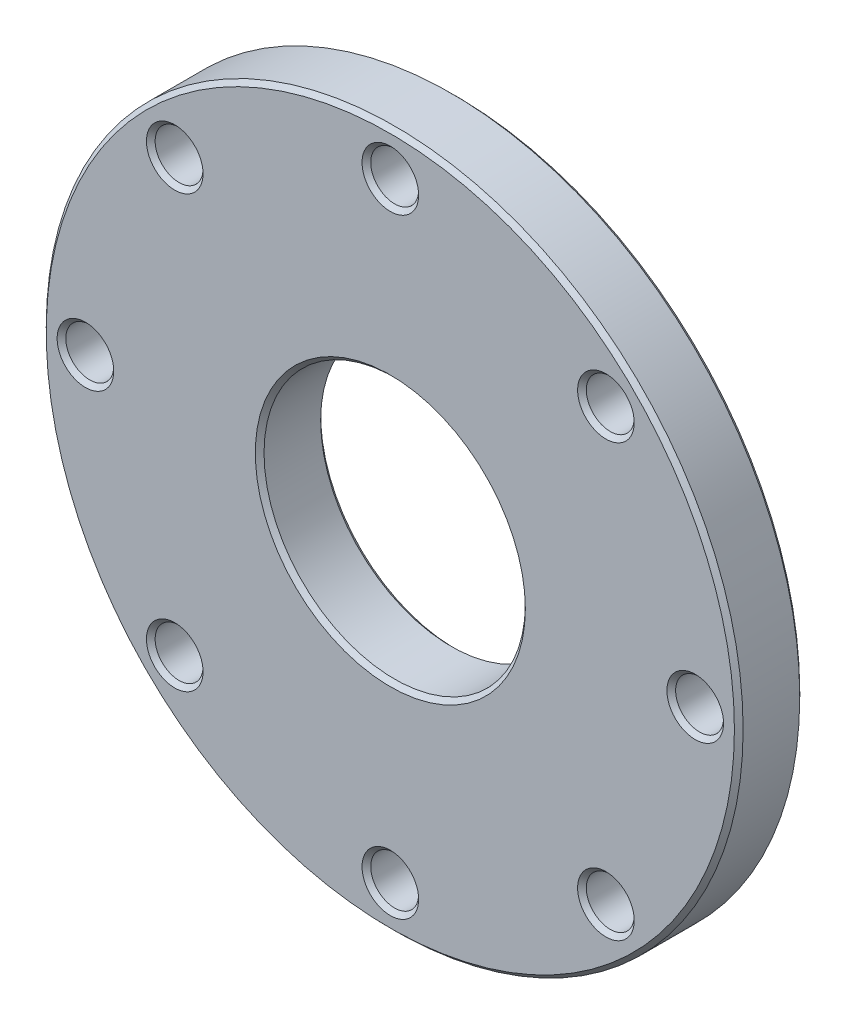
ISO-10303-21;
HEADER;
FILE_DESCRIPTION(('STEP AP214'),'2;1');
FILE_NAME('part.step','',(''),(''),'','','');
FILE_SCHEMA(('AUTOMOTIVE_DESIGN { 1 0 10303 214 1 1 1 1 }'));
ENDSEC;
DATA;
#1=APPLICATION_CONTEXT('core data for automotive mechanical design processes');
#2=APPLICATION_PROTOCOL_DEFINITION('international standard','automotive_design',2000,#1);
#3=PRODUCT_CONTEXT('',#1,'mechanical');
#4=PRODUCT('Part','Part','',(#3));
#5=PRODUCT_RELATED_PRODUCT_CATEGORY('part','',(#4));
#6=PRODUCT_DEFINITION_FORMATION('','',#4);
#7=PRODUCT_DEFINITION_CONTEXT('part definition',#1,'design');
#8=PRODUCT_DEFINITION('design','',#6,#7);
#9=PRODUCT_DEFINITION_SHAPE('','',#8);
#10=(LENGTH_UNIT() NAMED_UNIT(*) SI_UNIT(.MILLI.,.METRE.));
#11=(NAMED_UNIT(*) PLANE_ANGLE_UNIT() SI_UNIT($,.RADIAN.));
#12=(NAMED_UNIT(*) SI_UNIT($,.STERADIAN.) SOLID_ANGLE_UNIT());
#13=UNCERTAINTY_MEASURE_WITH_UNIT(LENGTH_MEASURE(1.E-05),#10,'distance_accuracy_value','');
#14=(GEOMETRIC_REPRESENTATION_CONTEXT(3) GLOBAL_UNCERTAINTY_ASSIGNED_CONTEXT((#13)) GLOBAL_UNIT_ASSIGNED_CONTEXT((#10,
#11,#12)) REPRESENTATION_CONTEXT('',''));
#15=CARTESIAN_POINT('',(0.,0.,0.));
#16=DIRECTION('',(0.,0.,1.));
#17=DIRECTION('',(1.,0.,0.));
#18=AXIS2_PLACEMENT_3D('',#15,#16,#17);
#19=CARTESIAN_POINT('',(-49.49747468305,49.497474683058,0.));
#20=DIRECTION('',(0.,0.,-1.));
#21=DIRECTION('',(1.,0.,0.));
#22=AXIS2_PLACEMENT_3D('',#19,#20,#21);
#23=CYLINDRICAL_SURFACE('',#22,5.5);
#24=CARTESIAN_POINT('',(-49.49747468305,49.497474683058,1.));
#25=DIRECTION('',(0.,0.,1.));
#26=DIRECTION('',(1.,0.,0.));
#27=AXIS2_PLACEMENT_3D('',#24,#25,#26);
#28=CIRCLE('',#27,5.5);
#29=CARTESIAN_POINT('',(-43.99747468305,49.497474683058,1.));
#30=VERTEX_POINT('',#29);
#31=EDGE_CURVE('E393',#30,#30,#28,.T.);
#32=ORIENTED_EDGE('',*,*,#31,.F.);
#33=DIRECTION('',(0.,0.,1.));
#34=VECTOR('',#33,1.);
#35=CARTESIAN_POINT('',(-43.99747468305,49.497474683058,0.));
#36=LINE('',#35,#34);
#37=CARTESIAN_POINT('',(-43.99747468305,49.497474683058,14.));
#38=VERTEX_POINT('',#37);
#39=EDGE_CURVE('E10',#30,#38,#36,.T.);
#40=ORIENTED_EDGE('',*,*,#39,.T.);
#41=CARTESIAN_POINT('',(-49.49747468305,49.497474683058,14.));
#42=DIRECTION('',(0.,0.,-1.));
#43=DIRECTION('',(1.,0.,0.));
#44=AXIS2_PLACEMENT_3D('',#41,#42,#43);
#45=CIRCLE('',#44,5.5);
#46=EDGE_CURVE('E431',#38,#38,#45,.T.);
#47=ORIENTED_EDGE('',*,*,#46,.F.);
#48=ORIENTED_EDGE('',*,*,#39,.F.);
#49=EDGE_LOOP('',(#32,#40,#47,#48));
#50=FACE_BOUND('',#49,.T.);
#51=ADVANCED_FACE('F16',(#50),#23,.F.);
#52=CARTESIAN_POINT('',(0.,70.,0.));
#53=DIRECTION('',(0.,0.,-1.));
#54=DIRECTION('',(1.,0.,0.));
#55=AXIS2_PLACEMENT_3D('',#52,#53,#54);
#56=CYLINDRICAL_SURFACE('',#55,5.5);
#57=CARTESIAN_POINT('',(0.,70.,1.));
#58=DIRECTION('',(0.,0.,1.));
#59=DIRECTION('',(1.,0.,0.));
#60=AXIS2_PLACEMENT_3D('',#57,#58,#59);
#61=CIRCLE('',#60,5.5);
#62=CARTESIAN_POINT('',(5.5,70.,1.));
#63=VERTEX_POINT('',#62);
#64=EDGE_CURVE('E241',#63,#63,#61,.T.);
#65=ORIENTED_EDGE('',*,*,#64,.F.);
#66=DIRECTION('',(0.,0.,1.));
#67=VECTOR('',#66,1.);
#68=CARTESIAN_POINT('',(5.5,70.,0.));
#69=LINE('',#68,#67);
#70=CARTESIAN_POINT('',(5.5,70.,14.));
#71=VERTEX_POINT('',#70);
#72=EDGE_CURVE('E25',#63,#71,#69,.T.);
#73=ORIENTED_EDGE('',*,*,#72,.T.);
#74=CARTESIAN_POINT('',(0.,70.,14.));
#75=DIRECTION('',(0.,0.,-1.));
#76=DIRECTION('',(1.,0.,0.));
#77=AXIS2_PLACEMENT_3D('',#74,#75,#76);
#78=CIRCLE('',#77,5.5);
#79=EDGE_CURVE('E411',#71,#71,#78,.T.);
#80=ORIENTED_EDGE('',*,*,#79,.F.);
#81=ORIENTED_EDGE('',*,*,#72,.F.);
#82=EDGE_LOOP('',(#65,#73,#80,#81));
#83=FACE_BOUND('',#82,.T.);
#84=ADVANCED_FACE('F18',(#83),#56,.F.);
#85=CARTESIAN_POINT('',(-70.,0.,0.));
#86=DIRECTION('',(0.,0.,-1.));
#87=DIRECTION('',(1.,0.,0.));
#88=AXIS2_PLACEMENT_3D('',#85,#86,#87);
#89=CYLINDRICAL_SURFACE('',#88,5.5);
#90=CARTESIAN_POINT('',(-70.,0.,1.));
#91=DIRECTION('',(0.,0.,1.));
#92=DIRECTION('',(1.,0.,0.));
#93=AXIS2_PLACEMENT_3D('',#90,#91,#92);
#94=CIRCLE('',#93,5.5);
#95=CARTESIAN_POINT('',(-64.5,0.,1.));
#96=VERTEX_POINT('',#95);
#97=EDGE_CURVE('E242',#96,#96,#94,.T.);
#98=ORIENTED_EDGE('',*,*,#97,.F.);
#99=DIRECTION('',(0.,0.,1.));
#100=VECTOR('',#99,1.);
#101=CARTESIAN_POINT('',(-64.5,0.,0.));
#102=LINE('',#101,#100);
#103=CARTESIAN_POINT('',(-64.5,0.,14.));
#104=VERTEX_POINT('',#103);
#105=EDGE_CURVE('E321',#96,#104,#102,.T.);
#106=ORIENTED_EDGE('',*,*,#105,.T.);
#107=CARTESIAN_POINT('',(-70.,0.,14.));
#108=DIRECTION('',(0.,0.,-1.));
#109=DIRECTION('',(1.,0.,0.));
#110=AXIS2_PLACEMENT_3D('',#107,#108,#109);
#111=CIRCLE('',#110,5.5);
#112=EDGE_CURVE('E423',#104,#104,#111,.T.);
#113=ORIENTED_EDGE('',*,*,#112,.F.);
#114=ORIENTED_EDGE('',*,*,#105,.F.);
#115=EDGE_LOOP('',(#98,#106,#113,#114));
#116=FACE_BOUND('',#115,.T.);
#117=ADVANCED_FACE('F508',(#116),#89,.F.);
#118=CARTESIAN_POINT('',(0.,0.,0.));
#119=DIRECTION('',(0.,0.,-1.));
#120=DIRECTION('',(1.,0.,0.));
#121=AXIS2_PLACEMENT_3D('',#118,#119,#120);
#122=CYLINDRICAL_SURFACE('',#121,30.);
#123=CARTESIAN_POINT('',(0.,0.,1.));
#124=DIRECTION('',(0.,0.,1.));
#125=DIRECTION('',(1.,0.,0.));
#126=AXIS2_PLACEMENT_3D('',#123,#124,#125);
#127=CIRCLE('',#126,30.);
#128=CARTESIAN_POINT('',(30.,0.,1.));
#129=VERTEX_POINT('',#128);
#130=EDGE_CURVE('E377',#129,#129,#127,.T.);
#131=ORIENTED_EDGE('',*,*,#130,.F.);
#132=DIRECTION('',(0.,0.,1.));
#133=VECTOR('',#132,1.);
#134=CARTESIAN_POINT('',(30.,0.,0.));
#135=LINE('',#134,#133);
#136=CARTESIAN_POINT('',(30.,0.,14.));
#137=VERTEX_POINT('',#136);
#138=EDGE_CURVE('E324',#129,#137,#135,.T.);
#139=ORIENTED_EDGE('',*,*,#138,.T.);
#140=CARTESIAN_POINT('',(0.,0.,14.));
#141=DIRECTION('',(0.,0.,-1.));
#142=DIRECTION('',(1.,0.,0.));
#143=AXIS2_PLACEMENT_3D('',#140,#141,#142);
#144=CIRCLE('',#143,30.);
#145=EDGE_CURVE('E439',#137,#137,#144,.T.);
#146=ORIENTED_EDGE('',*,*,#145,.F.);
#147=ORIENTED_EDGE('',*,*,#138,.F.);
#148=EDGE_LOOP('',(#131,#139,#146,#147));
#149=FACE_BOUND('',#148,.T.);
#150=ADVANCED_FACE('F513',(#149),#122,.F.);
#151=CARTESIAN_POINT('',(49.497474683058,49.497474683058,0.));
#152=DIRECTION('',(0.,0.,-1.));
#153=DIRECTION('',(1.,0.,0.));
#154=AXIS2_PLACEMENT_3D('',#151,#152,#153);
#155=CYLINDRICAL_SURFACE('',#154,5.5);
#156=CARTESIAN_POINT('',(49.497474683058,49.497474683058,1.));
#157=DIRECTION('',(0.,0.,1.));
#158=DIRECTION('',(1.,0.,0.));
#159=AXIS2_PLACEMENT_3D('',#156,#157,#158);
#160=CIRCLE('',#159,5.5);
#161=CARTESIAN_POINT('',(54.997474683058,49.497474683058,1.));
#162=VERTEX_POINT('',#161);
#163=EDGE_CURVE('E369',#162,#162,#160,.T.);
#164=ORIENTED_EDGE('',*,*,#163,.F.);
#165=DIRECTION('',(0.,0.,1.));
#166=VECTOR('',#165,1.);
#167=CARTESIAN_POINT('',(54.997474683058,49.497474683058,0.));
#168=LINE('',#167,#166);
#169=CARTESIAN_POINT('',(54.997474683058,49.497474683058,14.));
#170=VERTEX_POINT('',#169);
#171=EDGE_CURVE('E37',#162,#170,#168,.T.);
#172=ORIENTED_EDGE('',*,*,#171,.T.);
#173=CARTESIAN_POINT('',(49.497474683058,49.497474683058,14.));
#174=DIRECTION('',(0.,0.,-1.));
#175=DIRECTION('',(1.,0.,0.));
#176=AXIS2_PLACEMENT_3D('',#173,#174,#175);
#177=CIRCLE('',#176,5.5);
#178=EDGE_CURVE('E378',#170,#170,#177,.T.);
#179=ORIENTED_EDGE('',*,*,#178,.F.);
#180=ORIENTED_EDGE('',*,*,#171,.F.);
#181=EDGE_LOOP('',(#164,#172,#179,#180));
#182=FACE_BOUND('',#181,.T.);
#183=ADVANCED_FACE('F721',(#182),#155,.F.);
#184=CARTESIAN_POINT('',(70.,0.,0.));
#185=DIRECTION('',(0.,0.,-1.));
#186=DIRECTION('',(1.,0.,0.));
#187=AXIS2_PLACEMENT_3D('',#184,#185,#186);
#188=CYLINDRICAL_SURFACE('',#187,5.5);
#189=CARTESIAN_POINT('',(70.,0.,1.));
#190=DIRECTION('',(0.,0.,1.));
#191=DIRECTION('',(1.,0.,0.));
#192=AXIS2_PLACEMENT_3D('',#189,#190,#191);
#193=CIRCLE('',#192,5.5);
#194=CARTESIAN_POINT('',(75.5,0.,1.));
#195=VERTEX_POINT('',#194);
#196=EDGE_CURVE('E300',#195,#195,#193,.T.);
#197=ORIENTED_EDGE('',*,*,#196,.F.);
#198=DIRECTION('',(0.,0.,1.));
#199=VECTOR('',#198,1.);
#200=CARTESIAN_POINT('',(75.5,0.,0.));
#201=LINE('',#200,#199);
#202=CARTESIAN_POINT('',(75.5,0.,14.));
#203=VERTEX_POINT('',#202);
#204=EDGE_CURVE('E325',#195,#203,#201,.T.);
#205=ORIENTED_EDGE('',*,*,#204,.T.);
#206=CARTESIAN_POINT('',(70.,0.,14.));
#207=DIRECTION('',(0.,0.,-1.));
#208=DIRECTION('',(1.,0.,0.));
#209=AXIS2_PLACEMENT_3D('',#206,#207,#208);
#210=CIRCLE('',#209,5.5);
#211=EDGE_CURVE('E255',#203,#203,#210,.T.);
#212=ORIENTED_EDGE('',*,*,#211,.F.);
#213=ORIENTED_EDGE('',*,*,#204,.F.);
#214=EDGE_LOOP('',(#197,#205,#212,#213));
#215=FACE_BOUND('',#214,.T.);
#216=ADVANCED_FACE('F712',(#215),#188,.F.);
#217=CARTESIAN_POINT('',(-49.49747468305,-49.49747468305,0.));
#218=DIRECTION('',(0.,0.,-1.));
#219=DIRECTION('',(1.,0.,0.));
#220=AXIS2_PLACEMENT_3D('',#217,#218,#219);
#221=CYLINDRICAL_SURFACE('',#220,5.5);
#222=CARTESIAN_POINT('',(-49.49747468305,-49.49747468305,1.));
#223=DIRECTION('',(0.,0.,1.));
#224=DIRECTION('',(1.,0.,0.));
#225=AXIS2_PLACEMENT_3D('',#222,#223,#224);
#226=CIRCLE('',#225,5.5);
#227=CARTESIAN_POINT('',(-43.99747468305,-49.49747468305,1.));
#228=VERTEX_POINT('',#227);
#229=EDGE_CURVE('E301',#228,#228,#226,.T.);
#230=ORIENTED_EDGE('',*,*,#229,.F.);
#231=DIRECTION('',(0.,0.,1.));
#232=VECTOR('',#231,1.);
#233=CARTESIAN_POINT('',(-43.99747468305,-49.49747468305,0.));
#234=LINE('',#233,#232);
#235=CARTESIAN_POINT('',(-43.99747468305,-49.49747468305,14.));
#236=VERTEX_POINT('',#235);
#237=EDGE_CURVE('E328',#228,#236,#234,.T.);
#238=ORIENTED_EDGE('',*,*,#237,.T.);
#239=CARTESIAN_POINT('',(-49.49747468305,-49.49747468305,14.));
#240=DIRECTION('',(0.,0.,-1.));
#241=DIRECTION('',(1.,0.,0.));
#242=AXIS2_PLACEMENT_3D('',#239,#240,#241);
#243=CIRCLE('',#242,5.5);
#244=EDGE_CURVE('E401',#236,#236,#243,.T.);
#245=ORIENTED_EDGE('',*,*,#244,.F.);
#246=ORIENTED_EDGE('',*,*,#237,.F.);
#247=EDGE_LOOP('',(#230,#238,#245,#246));
#248=FACE_BOUND('',#247,.T.);
#249=ADVANCED_FACE('F703',(#248),#221,.F.);
#250=CARTESIAN_POINT('',(0.,-70.,0.));
#251=DIRECTION('',(0.,0.,-1.));
#252=DIRECTION('',(1.,0.,0.));
#253=AXIS2_PLACEMENT_3D('',#250,#251,#252);
#254=CYLINDRICAL_SURFACE('',#253,5.5);
#255=CARTESIAN_POINT('',(0.,-70.,1.));
#256=DIRECTION('',(0.,0.,1.));
#257=DIRECTION('',(1.,0.,0.));
#258=AXIS2_PLACEMENT_3D('',#255,#256,#257);
#259=CIRCLE('',#258,5.5);
#260=CARTESIAN_POINT('',(5.5,-70.,1.));
#261=VERTEX_POINT('',#260);
#262=EDGE_CURVE('E344',#261,#261,#259,.T.);
#263=ORIENTED_EDGE('',*,*,#262,.F.);
#264=DIRECTION('',(0.,0.,1.));
#265=VECTOR('',#264,1.);
#266=CARTESIAN_POINT('',(5.5,-70.,0.));
#267=LINE('',#266,#265);
#268=CARTESIAN_POINT('',(5.5,-70.,14.));
#269=VERTEX_POINT('',#268);
#270=EDGE_CURVE('E354',#261,#269,#267,.T.);
#271=ORIENTED_EDGE('',*,*,#270,.T.);
#272=CARTESIAN_POINT('',(0.,-70.,14.));
#273=DIRECTION('',(0.,0.,-1.));
#274=DIRECTION('',(1.,0.,0.));
#275=AXIS2_PLACEMENT_3D('',#272,#273,#274);
#276=CIRCLE('',#275,5.5);
#277=EDGE_CURVE('E226',#269,#269,#276,.T.);
#278=ORIENTED_EDGE('',*,*,#277,.F.);
#279=ORIENTED_EDGE('',*,*,#270,.F.);
#280=EDGE_LOOP('',(#263,#271,#278,#279));
#281=FACE_BOUND('',#280,.T.);
#282=ADVANCED_FACE('F694',(#281),#254,.F.);
#283=CARTESIAN_POINT('',(49.497474683058,-49.49747468305,0.));
#284=DIRECTION('',(0.,0.,-1.));
#285=DIRECTION('',(1.,0.,0.));
#286=AXIS2_PLACEMENT_3D('',#283,#284,#285);
#287=CYLINDRICAL_SURFACE('',#286,5.5);
#288=CARTESIAN_POINT('',(49.497474683058,-49.49747468305,1.));
#289=DIRECTION('',(0.,0.,1.));
#290=DIRECTION('',(1.,0.,0.));
#291=AXIS2_PLACEMENT_3D('',#288,#289,#290);
#292=CIRCLE('',#291,5.5);
#293=CARTESIAN_POINT('',(54.997474683058,-49.49747468305,1.));
#294=VERTEX_POINT('',#293);
#295=EDGE_CURVE('E336',#294,#294,#292,.T.);
#296=ORIENTED_EDGE('',*,*,#295,.F.);
#297=DIRECTION('',(0.,0.,1.));
#298=VECTOR('',#297,1.);
#299=CARTESIAN_POINT('',(54.997474683058,-49.49747468305,0.));
#300=LINE('',#299,#298);
#301=CARTESIAN_POINT('',(54.997474683058,-49.49747468305,14.));
#302=VERTEX_POINT('',#301);
#303=EDGE_CURVE('E381',#294,#302,#300,.T.);
#304=ORIENTED_EDGE('',*,*,#303,.T.);
#305=CARTESIAN_POINT('',(49.497474683058,-49.49747468305,14.));
#306=DIRECTION('',(0.,0.,-1.));
#307=DIRECTION('',(1.,0.,0.));
#308=AXIS2_PLACEMENT_3D('',#305,#306,#307);
#309=CIRCLE('',#308,5.5);
#310=EDGE_CURVE('E415',#302,#302,#309,.T.);
#311=ORIENTED_EDGE('',*,*,#310,.F.);
#312=ORIENTED_EDGE('',*,*,#303,.F.);
#313=EDGE_LOOP('',(#296,#304,#311,#312));
#314=FACE_BOUND('',#313,.T.);
#315=ADVANCED_FACE('F685',(#314),#287,.F.);
#316=CARTESIAN_POINT('',(49.497474683058,49.497474683058,14.));
#317=DIRECTION('',(0.,0.,1.));
#318=DIRECTION('',(1.,0.,0.));
#319=AXIS2_PLACEMENT_3D('',#316,#317,#318);
#320=CONICAL_SURFACE('',#319,5.5,0.785398163397);
#321=DIRECTION('',(-0.707106781186548,0.,-0.707106781186548));
#322=VECTOR('',#321,1.);
#323=CARTESIAN_POINT('',(54.997474683058,49.497474683058,14.));
#324=LINE('',#323,#322);
#325=CARTESIAN_POINT('',(55.997474683058,49.497474683058,15.));
#326=VERTEX_POINT('',#325);
#327=EDGE_CURVE('E382',#326,#170,#324,.T.);
#328=ORIENTED_EDGE('',*,*,#327,.T.);
#329=ORIENTED_EDGE('',*,*,#178,.T.);
#330=ORIENTED_EDGE('',*,*,#327,.F.);
#331=CARTESIAN_POINT('',(49.497474683058,49.497474683058,15.));
#332=DIRECTION('',(0.,0.,-1.));
#333=DIRECTION('',(1.,0.,0.));
#334=AXIS2_PLACEMENT_3D('',#331,#332,#333);
#335=CIRCLE('',#334,6.5);
#336=EDGE_CURVE('E320',#326,#326,#335,.T.);
#337=ORIENTED_EDGE('',*,*,#336,.F.);
#338=EDGE_LOOP('',(#328,#329,#330,#337));
#339=FACE_BOUND('',#338,.T.);
#340=ADVANCED_FACE('F676',(#339),#320,.F.);
#341=CARTESIAN_POINT('',(0.,70.,14.));
#342=DIRECTION('',(0.,0.,1.));
#343=DIRECTION('',(1.,0.,0.));
#344=AXIS2_PLACEMENT_3D('',#341,#342,#343);
#345=CONICAL_SURFACE('',#344,5.5,0.785398163397);
#346=DIRECTION('',(-0.707106781186548,0.,-0.707106781186548));
#347=VECTOR('',#346,1.);
#348=CARTESIAN_POINT('',(5.5,70.,14.));
#349=LINE('',#348,#347);
#350=CARTESIAN_POINT('',(6.5,70.,15.));
#351=VERTEX_POINT('',#350);
#352=EDGE_CURVE('E259',#351,#71,#349,.T.);
#353=ORIENTED_EDGE('',*,*,#352,.T.);
#354=ORIENTED_EDGE('',*,*,#79,.T.);
#355=ORIENTED_EDGE('',*,*,#352,.F.);
#356=CARTESIAN_POINT('',(0.,70.,15.));
#357=DIRECTION('',(0.,0.,-1.));
#358=DIRECTION('',(1.,0.,0.));
#359=AXIS2_PLACEMENT_3D('',#356,#357,#358);
#360=CIRCLE('',#359,6.5);
#361=EDGE_CURVE('E316',#351,#351,#360,.T.);
#362=ORIENTED_EDGE('',*,*,#361,.F.);
#363=EDGE_LOOP('',(#353,#354,#355,#362));
#364=FACE_BOUND('',#363,.T.);
#365=ADVANCED_FACE('F598',(#364),#345,.F.);
#366=CARTESIAN_POINT('',(70.,0.,14.));
#367=DIRECTION('',(0.,0.,1.));
#368=DIRECTION('',(1.,0.,0.));
#369=AXIS2_PLACEMENT_3D('',#366,#367,#368);
#370=CONICAL_SURFACE('',#369,5.5,0.785398163397);
#371=DIRECTION('',(-0.707106781186548,0.,-0.707106781186548));
#372=VECTOR('',#371,1.);
#373=CARTESIAN_POINT('',(75.5,0.,14.));
#374=LINE('',#373,#372);
#375=CARTESIAN_POINT('',(76.5,0.,15.));
#376=VERTEX_POINT('',#375);
#377=EDGE_CURVE('E260',#376,#203,#374,.T.);
#378=ORIENTED_EDGE('',*,*,#377,.T.);
#379=ORIENTED_EDGE('',*,*,#211,.T.);
#380=ORIENTED_EDGE('',*,*,#377,.F.);
#381=CARTESIAN_POINT('',(70.,0.,15.));
#382=DIRECTION('',(0.,0.,-1.));
#383=DIRECTION('',(1.,0.,0.));
#384=AXIS2_PLACEMENT_3D('',#381,#382,#383);
#385=CIRCLE('',#384,6.5);
#386=EDGE_CURVE('E312',#376,#376,#385,.T.);
#387=ORIENTED_EDGE('',*,*,#386,.F.);
#388=EDGE_LOOP('',(#378,#379,#380,#387));
#389=FACE_BOUND('',#388,.T.);
#390=ADVANCED_FACE('F592',(#389),#370,.F.);
#391=CARTESIAN_POINT('',(0.,0.,14.));
#392=DIRECTION('',(0.,0.,1.));
#393=DIRECTION('',(1.,0.,0.));
#394=AXIS2_PLACEMENT_3D('',#391,#392,#393);
#395=CONICAL_SURFACE('',#394,30.,0.785398163397);
#396=DIRECTION('',(-0.707106781186548,0.,-0.707106781186548));
#397=VECTOR('',#396,1.);
#398=CARTESIAN_POINT('',(30.,0.,14.));
#399=LINE('',#398,#397);
#400=CARTESIAN_POINT('',(31.,0.,15.));
#401=VERTEX_POINT('',#400);
#402=EDGE_CURVE('E435',#401,#137,#399,.T.);
#403=ORIENTED_EDGE('',*,*,#402,.T.);
#404=ORIENTED_EDGE('',*,*,#145,.T.);
#405=ORIENTED_EDGE('',*,*,#402,.F.);
#406=CARTESIAN_POINT('',(0.,0.,15.));
#407=DIRECTION('',(0.,0.,-1.));
#408=DIRECTION('',(1.,0.,0.));
#409=AXIS2_PLACEMENT_3D('',#406,#407,#408);
#410=CIRCLE('',#409,31.);
#411=EDGE_CURVE('E285',#401,#401,#410,.T.);
#412=ORIENTED_EDGE('',*,*,#411,.F.);
#413=EDGE_LOOP('',(#403,#404,#405,#412));
#414=FACE_BOUND('',#413,.T.);
#415=ADVANCED_FACE('F597',(#414),#395,.F.);
#416=CARTESIAN_POINT('',(-49.49747468305,49.497474683058,14.));
#417=DIRECTION('',(0.,0.,1.));
#418=DIRECTION('',(1.,0.,0.));
#419=AXIS2_PLACEMENT_3D('',#416,#417,#418);
#420=CONICAL_SURFACE('',#419,5.5,0.785398163397);
#421=DIRECTION('',(-0.707106781186548,0.,-0.707106781186548));
#422=VECTOR('',#421,1.);
#423=CARTESIAN_POINT('',(-43.99747468305,49.497474683058,14.));
#424=LINE('',#423,#422);
#425=CARTESIAN_POINT('',(-42.99747468305,49.497474683058,15.));
#426=VERTEX_POINT('',#425);
#427=EDGE_CURVE('E427',#426,#38,#424,.T.);
#428=ORIENTED_EDGE('',*,*,#427,.T.);
#429=ORIENTED_EDGE('',*,*,#46,.T.);
#430=ORIENTED_EDGE('',*,*,#427,.F.);
#431=CARTESIAN_POINT('',(-49.49747468305,49.497474683058,15.));
#432=DIRECTION('',(0.,0.,-1.));
#433=DIRECTION('',(1.,0.,0.));
#434=AXIS2_PLACEMENT_3D('',#431,#432,#433);
#435=CIRCLE('',#434,6.5);
#436=EDGE_CURVE('E281',#426,#426,#435,.T.);
#437=ORIENTED_EDGE('',*,*,#436,.F.);
#438=EDGE_LOOP('',(#428,#429,#430,#437));
#439=FACE_BOUND('',#438,.T.);
#440=ADVANCED_FACE('F653',(#439),#420,.F.);
#441=CARTESIAN_POINT('',(-70.,0.,14.));
#442=DIRECTION('',(0.,0.,1.));
#443=DIRECTION('',(1.,0.,0.));
#444=AXIS2_PLACEMENT_3D('',#441,#442,#443);
#445=CONICAL_SURFACE('',#444,5.5,0.785398163397);
#446=DIRECTION('',(-0.707106781186548,0.,-0.707106781186548));
#447=VECTOR('',#446,1.);
#448=CARTESIAN_POINT('',(-64.5,0.,14.));
#449=LINE('',#448,#447);
#450=CARTESIAN_POINT('',(-63.5,0.,15.));
#451=VERTEX_POINT('',#450);
#452=EDGE_CURVE('E419',#451,#104,#449,.T.);
#453=ORIENTED_EDGE('',*,*,#452,.T.);
#454=ORIENTED_EDGE('',*,*,#112,.T.);
#455=ORIENTED_EDGE('',*,*,#452,.F.);
#456=CARTESIAN_POINT('',(-70.,0.,15.));
#457=DIRECTION('',(0.,0.,-1.));
#458=DIRECTION('',(1.,0.,0.));
#459=AXIS2_PLACEMENT_3D('',#456,#457,#458);
#460=CIRCLE('',#459,6.5);
#461=EDGE_CURVE('E286',#451,#451,#460,.T.);
#462=ORIENTED_EDGE('',*,*,#461,.F.);
#463=EDGE_LOOP('',(#453,#454,#455,#462));
#464=FACE_BOUND('',#463,.T.);
#465=ADVANCED_FACE('F636',(#464),#445,.F.);
#466=CARTESIAN_POINT('',(49.497474683058,-49.49747468305,14.));
#467=DIRECTION('',(0.,0.,1.));
#468=DIRECTION('',(1.,0.,0.));
#469=AXIS2_PLACEMENT_3D('',#466,#467,#468);
#470=CONICAL_SURFACE('',#469,5.5,0.785398163397);
#471=DIRECTION('',(-0.707106781186548,0.,-0.707106781186548));
#472=VECTOR('',#471,1.);
#473=CARTESIAN_POINT('',(54.997474683058,-49.49747468305,14.));
#474=LINE('',#473,#472);
#475=CARTESIAN_POINT('',(55.997474683058,-49.49747468305,15.));
#476=VERTEX_POINT('',#475);
#477=EDGE_CURVE('E228',#476,#302,#474,.T.);
#478=ORIENTED_EDGE('',*,*,#477,.T.);
#479=ORIENTED_EDGE('',*,*,#310,.T.);
#480=ORIENTED_EDGE('',*,*,#477,.F.);
#481=CARTESIAN_POINT('',(49.497474683058,-49.49747468305,15.));
#482=DIRECTION('',(0.,0.,-1.));
#483=DIRECTION('',(1.,0.,0.));
#484=AXIS2_PLACEMENT_3D('',#481,#482,#483);
#485=CIRCLE('',#484,6.5);
#486=EDGE_CURVE('E305',#476,#476,#485,.T.);
#487=ORIENTED_EDGE('',*,*,#486,.F.);
#488=EDGE_LOOP('',(#478,#479,#480,#487));
#489=FACE_BOUND('',#488,.T.);
#490=ADVANCED_FACE('F544',(#489),#470,.F.);
#491=CARTESIAN_POINT('',(0.,-70.,14.));
#492=DIRECTION('',(0.,0.,1.));
#493=DIRECTION('',(1.,0.,0.));
#494=AXIS2_PLACEMENT_3D('',#491,#492,#493);
#495=CONICAL_SURFACE('',#494,5.5,0.785398163397);
#496=DIRECTION('',(-0.707106781186548,0.,-0.707106781186548));
#497=VECTOR('',#496,1.);
#498=CARTESIAN_POINT('',(5.5,-70.,14.));
#499=LINE('',#498,#497);
#500=CARTESIAN_POINT('',(6.5,-70.,15.));
#501=VERTEX_POINT('',#500);
#502=EDGE_CURVE('E229',#501,#269,#499,.T.);
#503=ORIENTED_EDGE('',*,*,#502,.T.);
#504=ORIENTED_EDGE('',*,*,#277,.T.);
#505=ORIENTED_EDGE('',*,*,#502,.F.);
#506=CARTESIAN_POINT('',(0.,-70.,15.));
#507=DIRECTION('',(0.,0.,-1.));
#508=DIRECTION('',(1.,0.,0.));
#509=AXIS2_PLACEMENT_3D('',#506,#507,#508);
#510=CIRCLE('',#509,6.5);
#511=EDGE_CURVE('E295',#501,#501,#510,.T.);
#512=ORIENTED_EDGE('',*,*,#511,.F.);
#513=EDGE_LOOP('',(#503,#504,#505,#512));
#514=FACE_BOUND('',#513,.T.);
#515=ADVANCED_FACE('F538',(#514),#495,.F.);
#516=CARTESIAN_POINT('',(-49.49747468305,-49.49747468305,14.));
#517=DIRECTION('',(0.,0.,1.));
#518=DIRECTION('',(1.,0.,0.));
#519=AXIS2_PLACEMENT_3D('',#516,#517,#518);
#520=CONICAL_SURFACE('',#519,5.5,0.785398163397);
#521=DIRECTION('',(-0.707106781186548,0.,-0.707106781186548));
#522=VECTOR('',#521,1.);
#523=CARTESIAN_POINT('',(-43.99747468305,-49.49747468305,14.));
#524=LINE('',#523,#522);
#525=CARTESIAN_POINT('',(-42.99747468305,-49.49747468305,15.));
#526=VERTEX_POINT('',#525);
#527=EDGE_CURVE('E397',#526,#236,#524,.T.);
#528=ORIENTED_EDGE('',*,*,#527,.T.);
#529=ORIENTED_EDGE('',*,*,#244,.T.);
#530=ORIENTED_EDGE('',*,*,#527,.F.);
#531=CARTESIAN_POINT('',(-49.49747468305,-49.49747468305,15.));
#532=DIRECTION('',(0.,0.,-1.));
#533=DIRECTION('',(1.,0.,0.));
#534=AXIS2_PLACEMENT_3D('',#531,#532,#533);
#535=CIRCLE('',#534,6.5);
#536=EDGE_CURVE('E291',#526,#526,#535,.T.);
#537=ORIENTED_EDGE('',*,*,#536,.F.);
#538=EDGE_LOOP('',(#528,#529,#530,#537));
#539=FACE_BOUND('',#538,.T.);
#540=ADVANCED_FACE('F543',(#539),#520,.F.);
#541=CARTESIAN_POINT('',(-49.49747468305,49.497474683058,1.));
#542=DIRECTION('',(0.,0.,-1.));
#543=DIRECTION('',(1.,0.,0.));
#544=AXIS2_PLACEMENT_3D('',#541,#542,#543);
#545=CONICAL_SURFACE('',#544,5.5,0.785398163397);
#546=DIRECTION('',(-0.707106781186548,0.,0.707106781186548));
#547=VECTOR('',#546,1.);
#548=CARTESIAN_POINT('',(-43.99747468305,49.497474683058,1.));
#549=LINE('',#548,#547);
#550=CARTESIAN_POINT('',(-42.99747468305,49.497474683058,0.));
#551=VERTEX_POINT('',#550);
#552=EDGE_CURVE('E389',#551,#30,#549,.T.);
#553=ORIENTED_EDGE('',*,*,#552,.T.);
#554=ORIENTED_EDGE('',*,*,#31,.T.);
#555=ORIENTED_EDGE('',*,*,#552,.F.);
#556=CARTESIAN_POINT('',(-49.49747468305,49.497474683058,0.));
#557=DIRECTION('',(0.,0.,1.));
#558=DIRECTION('',(1.,0.,0.));
#559=AXIS2_PLACEMENT_3D('',#556,#557,#558);
#560=CIRCLE('',#559,6.5);
#561=EDGE_CURVE('E290',#551,#551,#560,.T.);
#562=ORIENTED_EDGE('',*,*,#561,.F.);
#563=EDGE_LOOP('',(#553,#554,#555,#562));
#564=FACE_BOUND('',#563,.T.);
#565=ADVANCED_FACE('F493',(#564),#545,.F.);
#566=CARTESIAN_POINT('',(0.,70.,1.));
#567=DIRECTION('',(0.,0.,-1.));
#568=DIRECTION('',(1.,0.,0.));
#569=AXIS2_PLACEMENT_3D('',#566,#567,#568);
#570=CONICAL_SURFACE('',#569,5.5,0.785398163397);
#571=DIRECTION('',(-0.707106781186548,0.,0.707106781186548));
#572=VECTOR('',#571,1.);
#573=CARTESIAN_POINT('',(5.5,70.,1.));
#574=LINE('',#573,#572);
#575=CARTESIAN_POINT('',(6.5,70.,0.));
#576=VERTEX_POINT('',#575);
#577=EDGE_CURVE('E237',#576,#63,#574,.T.);
#578=ORIENTED_EDGE('',*,*,#577,.T.);
#579=ORIENTED_EDGE('',*,*,#64,.T.);
#580=ORIENTED_EDGE('',*,*,#577,.F.);
#581=CARTESIAN_POINT('',(0.,70.,0.));
#582=DIRECTION('',(0.,0.,1.));
#583=DIRECTION('',(1.,0.,0.));
#584=AXIS2_PLACEMENT_3D('',#581,#582,#583);
#585=CIRCLE('',#584,6.5);
#586=EDGE_CURVE('E234',#576,#576,#585,.T.);
#587=ORIENTED_EDGE('',*,*,#586,.F.);
#588=EDGE_LOOP('',(#578,#579,#580,#587));
#589=FACE_BOUND('',#588,.T.);
#590=ADVANCED_FACE('F487',(#589),#570,.F.);
#591=CARTESIAN_POINT('',(-70.,0.,1.));
#592=DIRECTION('',(0.,0.,-1.));
#593=DIRECTION('',(1.,0.,0.));
#594=AXIS2_PLACEMENT_3D('',#591,#592,#593);
#595=CONICAL_SURFACE('',#594,5.5,0.785398163397);
#596=DIRECTION('',(-0.707106781186548,0.,0.707106781186548));
#597=VECTOR('',#596,1.);
#598=CARTESIAN_POINT('',(-64.5,0.,1.));
#599=LINE('',#598,#597);
#600=CARTESIAN_POINT('',(-63.5,0.,0.));
#601=VERTEX_POINT('',#600);
#602=EDGE_CURVE('E358',#601,#96,#599,.T.);
#603=ORIENTED_EDGE('',*,*,#602,.T.);
#604=ORIENTED_EDGE('',*,*,#97,.T.);
#605=ORIENTED_EDGE('',*,*,#602,.F.);
#606=CARTESIAN_POINT('',(-70.,0.,0.));
#607=DIRECTION('',(0.,0.,1.));
#608=DIRECTION('',(1.,0.,0.));
#609=AXIS2_PLACEMENT_3D('',#606,#607,#608);
#610=CIRCLE('',#609,6.5);
#611=EDGE_CURVE('E231',#601,#601,#610,.T.);
#612=ORIENTED_EDGE('',*,*,#611,.F.);
#613=EDGE_LOOP('',(#603,#604,#605,#612));
#614=FACE_BOUND('',#613,.T.);
#615=ADVANCED_FACE('F492',(#614),#595,.F.);
#616=CARTESIAN_POINT('',(0.,0.,1.));
#617=DIRECTION('',(0.,0.,-1.));
#618=DIRECTION('',(1.,0.,0.));
#619=AXIS2_PLACEMENT_3D('',#616,#617,#618);
#620=CONICAL_SURFACE('',#619,30.,0.785398163397);
#621=DIRECTION('',(-0.707106781186548,0.,0.707106781186548));
#622=VECTOR('',#621,1.);
#623=CARTESIAN_POINT('',(30.,0.,1.));
#624=LINE('',#623,#622);
#625=CARTESIAN_POINT('',(31.,0.,0.));
#626=VERTEX_POINT('',#625);
#627=EDGE_CURVE('E373',#626,#129,#624,.T.);
#628=ORIENTED_EDGE('',*,*,#627,.T.);
#629=ORIENTED_EDGE('',*,*,#130,.T.);
#630=ORIENTED_EDGE('',*,*,#627,.F.);
#631=CARTESIAN_POINT('',(0.,0.,0.));
#632=DIRECTION('',(0.,0.,1.));
#633=DIRECTION('',(1.,0.,0.));
#634=AXIS2_PLACEMENT_3D('',#631,#632,#633);
#635=CIRCLE('',#634,31.);
#636=EDGE_CURVE('E235',#626,#626,#635,.T.);
#637=ORIENTED_EDGE('',*,*,#636,.F.);
#638=EDGE_LOOP('',(#628,#629,#630,#637));
#639=FACE_BOUND('',#638,.T.);
#640=ADVANCED_FACE('F583',(#639),#620,.F.);
#641=CARTESIAN_POINT('',(49.497474683058,49.497474683058,1.));
#642=DIRECTION('',(0.,0.,-1.));
#643=DIRECTION('',(1.,0.,0.));
#644=AXIS2_PLACEMENT_3D('',#641,#642,#643);
#645=CONICAL_SURFACE('',#644,5.5,0.785398163397);
#646=DIRECTION('',(-0.707106781186548,0.,0.707106781186548));
#647=VECTOR('',#646,1.);
#648=CARTESIAN_POINT('',(54.997474683058,49.497474683058,1.));
#649=LINE('',#648,#647);
#650=CARTESIAN_POINT('',(55.997474683058,49.497474683058,0.));
#651=VERTEX_POINT('',#650);
#652=EDGE_CURVE('E365',#651,#162,#649,.T.);
#653=ORIENTED_EDGE('',*,*,#652,.T.);
#654=ORIENTED_EDGE('',*,*,#163,.T.);
#655=ORIENTED_EDGE('',*,*,#652,.F.);
#656=CARTESIAN_POINT('',(49.497474683058,49.497474683058,0.));
#657=DIRECTION('',(0.,0.,1.));
#658=DIRECTION('',(1.,0.,0.));
#659=AXIS2_PLACEMENT_3D('',#656,#657,#658);
#660=CIRCLE('',#659,6.5);
#661=EDGE_CURVE('E274',#651,#651,#660,.T.);
#662=ORIENTED_EDGE('',*,*,#661,.F.);
#663=EDGE_LOOP('',(#653,#654,#655,#662));
#664=FACE_BOUND('',#663,.T.);
#665=ADVANCED_FACE('F480',(#664),#645,.F.);
#666=CARTESIAN_POINT('',(70.,0.,1.));
#667=DIRECTION('',(0.,0.,-1.));
#668=DIRECTION('',(1.,0.,0.));
#669=AXIS2_PLACEMENT_3D('',#666,#667,#668);
#670=CONICAL_SURFACE('',#669,5.5,0.785398163397);
#671=DIRECTION('',(-0.707106781186548,0.,0.707106781186548));
#672=VECTOR('',#671,1.);
#673=CARTESIAN_POINT('',(75.5,0.,1.));
#674=LINE('',#673,#672);
#675=CARTESIAN_POINT('',(76.5,0.,0.));
#676=VERTEX_POINT('',#675);
#677=EDGE_CURVE('E296',#676,#195,#674,.T.);
#678=ORIENTED_EDGE('',*,*,#677,.T.);
#679=ORIENTED_EDGE('',*,*,#196,.T.);
#680=ORIENTED_EDGE('',*,*,#677,.F.);
#681=CARTESIAN_POINT('',(70.,0.,0.));
#682=DIRECTION('',(0.,0.,1.));
#683=DIRECTION('',(1.,0.,0.));
#684=AXIS2_PLACEMENT_3D('',#681,#682,#683);
#685=CIRCLE('',#684,6.5);
#686=EDGE_CURVE('E270',#676,#676,#685,.T.);
#687=ORIENTED_EDGE('',*,*,#686,.F.);
#688=EDGE_LOOP('',(#678,#679,#680,#687));
#689=FACE_BOUND('',#688,.T.);
#690=ADVANCED_FACE('F474',(#689),#670,.F.);
#691=CARTESIAN_POINT('',(-49.49747468305,-49.49747468305,1.));
#692=DIRECTION('',(0.,0.,-1.));
#693=DIRECTION('',(1.,0.,0.));
#694=AXIS2_PLACEMENT_3D('',#691,#692,#693);
#695=CONICAL_SURFACE('',#694,5.5,0.785398163397);
#696=DIRECTION('',(-0.707106781186548,0.,0.707106781186548));
#697=VECTOR('',#696,1.);
#698=CARTESIAN_POINT('',(-43.99747468305,-49.49747468305,1.));
#699=LINE('',#698,#697);
#700=CARTESIAN_POINT('',(-42.99747468305,-49.49747468305,0.));
#701=VERTEX_POINT('',#700);
#702=EDGE_CURVE('E348',#701,#228,#699,.T.);
#703=ORIENTED_EDGE('',*,*,#702,.T.);
#704=ORIENTED_EDGE('',*,*,#229,.T.);
#705=ORIENTED_EDGE('',*,*,#702,.F.);
#706=CARTESIAN_POINT('',(-49.49747468305,-49.49747468305,0.));
#707=DIRECTION('',(0.,0.,1.));
#708=DIRECTION('',(1.,0.,0.));
#709=AXIS2_PLACEMENT_3D('',#706,#707,#708);
#710=CIRCLE('',#709,6.5);
#711=EDGE_CURVE('E266',#701,#701,#710,.T.);
#712=ORIENTED_EDGE('',*,*,#711,.F.);
#713=EDGE_LOOP('',(#703,#704,#705,#712));
#714=FACE_BOUND('',#713,.T.);
#715=ADVANCED_FACE('F479',(#714),#695,.F.);
#716=CARTESIAN_POINT('',(0.,-70.,1.));
#717=DIRECTION('',(0.,0.,-1.));
#718=DIRECTION('',(1.,0.,0.));
#719=AXIS2_PLACEMENT_3D('',#716,#717,#718);
#720=CONICAL_SURFACE('',#719,5.5,0.785398163397);
#721=DIRECTION('',(-0.707106781186548,0.,0.707106781186548));
#722=VECTOR('',#721,1.);
#723=CARTESIAN_POINT('',(5.5,-70.,1.));
#724=LINE('',#723,#722);
#725=CARTESIAN_POINT('',(6.5,-70.,0.));
#726=VERTEX_POINT('',#725);
#727=EDGE_CURVE('E340',#726,#261,#724,.T.);
#728=ORIENTED_EDGE('',*,*,#727,.T.);
#729=ORIENTED_EDGE('',*,*,#262,.T.);
#730=ORIENTED_EDGE('',*,*,#727,.F.);
#731=CARTESIAN_POINT('',(0.,-70.,0.));
#732=DIRECTION('',(0.,0.,1.));
#733=DIRECTION('',(1.,0.,0.));
#734=AXIS2_PLACEMENT_3D('',#731,#732,#733);
#735=CIRCLE('',#734,6.5);
#736=EDGE_CURVE('E247',#726,#726,#735,.T.);
#737=ORIENTED_EDGE('',*,*,#736,.F.);
#738=EDGE_LOOP('',(#728,#729,#730,#737));
#739=FACE_BOUND('',#738,.T.);
#740=ADVANCED_FACE('F563',(#739),#720,.F.);
#741=CARTESIAN_POINT('',(49.497474683058,-49.49747468305,1.));
#742=DIRECTION('',(0.,0.,-1.));
#743=DIRECTION('',(1.,0.,0.));
#744=AXIS2_PLACEMENT_3D('',#741,#742,#743);
#745=CONICAL_SURFACE('',#744,5.5,0.785398163397);
#746=DIRECTION('',(-0.707106781186548,0.,0.707106781186548));
#747=VECTOR('',#746,1.);
#748=CARTESIAN_POINT('',(54.997474683058,-49.49747468305,1.));
#749=LINE('',#748,#747);
#750=CARTESIAN_POINT('',(55.997474683058,-49.49747468305,0.));
#751=VERTEX_POINT('',#750);
#752=EDGE_CURVE('E332',#751,#294,#749,.T.);
#753=ORIENTED_EDGE('',*,*,#752,.T.);
#754=ORIENTED_EDGE('',*,*,#295,.T.);
#755=ORIENTED_EDGE('',*,*,#752,.F.);
#756=CARTESIAN_POINT('',(49.497474683058,-49.49747468305,0.));
#757=DIRECTION('',(0.,0.,1.));
#758=DIRECTION('',(1.,0.,0.));
#759=AXIS2_PLACEMENT_3D('',#756,#757,#758);
#760=CIRCLE('',#759,6.5);
#761=EDGE_CURVE('E243',#751,#751,#760,.T.);
#762=ORIENTED_EDGE('',*,*,#761,.F.);
#763=EDGE_LOOP('',(#753,#754,#755,#762));
#764=FACE_BOUND('',#763,.T.);
#765=ADVANCED_FACE('F554',(#764),#745,.F.);
#766=CARTESIAN_POINT('',(0.,0.,15.));
#767=DIRECTION('',(0.,0.,1.));
#768=DIRECTION('',(1.,0.,0.));
#769=AXIS2_PLACEMENT_3D('',#766,#767,#768);
#770=PLANE('',#769);
#771=ORIENTED_EDGE('',*,*,#336,.T.);
#772=EDGE_LOOP('',(#771));
#773=FACE_BOUND('',#772,.T.);
#774=ORIENTED_EDGE('',*,*,#361,.T.);
#775=EDGE_LOOP('',(#774));
#776=FACE_BOUND('',#775,.T.);
#777=ORIENTED_EDGE('',*,*,#386,.T.);
#778=EDGE_LOOP('',(#777));
#779=FACE_BOUND('',#778,.T.);
#780=ORIENTED_EDGE('',*,*,#411,.T.);
#781=EDGE_LOOP('',(#780));
#782=FACE_BOUND('',#781,.T.);
#783=ORIENTED_EDGE('',*,*,#436,.T.);
#784=EDGE_LOOP('',(#783));
#785=FACE_BOUND('',#784,.T.);
#786=ORIENTED_EDGE('',*,*,#461,.T.);
#787=EDGE_LOOP('',(#786));
#788=FACE_BOUND('',#787,.T.);
#789=ORIENTED_EDGE('',*,*,#486,.T.);
#790=EDGE_LOOP('',(#789));
#791=FACE_BOUND('',#790,.T.);
#792=ORIENTED_EDGE('',*,*,#511,.T.);
#793=EDGE_LOOP('',(#792));
#794=FACE_BOUND('',#793,.T.);
#795=ORIENTED_EDGE('',*,*,#536,.T.);
#796=EDGE_LOOP('',(#795));
#797=FACE_BOUND('',#796,.T.);
#798=CARTESIAN_POINT('',(0.,0.,15.));
#799=DIRECTION('',(0.,0.,1.));
#800=DIRECTION('',(1.,0.,0.));
#801=AXIS2_PLACEMENT_3D('',#798,#799,#800);
#802=CIRCLE('',#801,79.);
#803=CARTESIAN_POINT('',(79.,0.,15.));
#804=VERTEX_POINT('',#803);
#805=EDGE_CURVE('E248',#804,#804,#802,.T.);
#806=ORIENTED_EDGE('',*,*,#805,.T.);
#807=EDGE_LOOP('',(#806));
#808=FACE_BOUND('',#807,.T.);
#809=ADVANCED_FACE('F532',(#773,#776,#779,#782,#785,#788,#791,#794,#797,#808),#770,.T.);
#810=CARTESIAN_POINT('',(0.,0.,0.));
#811=DIRECTION('',(0.,0.,1.));
#812=DIRECTION('',(1.,0.,0.));
#813=AXIS2_PLACEMENT_3D('',#810,#811,#812);
#814=PLANE('',#813);
#815=ORIENTED_EDGE('',*,*,#561,.T.);
#816=EDGE_LOOP('',(#815));
#817=FACE_BOUND('',#816,.T.);
#818=ORIENTED_EDGE('',*,*,#586,.T.);
#819=EDGE_LOOP('',(#818));
#820=FACE_BOUND('',#819,.T.);
#821=ORIENTED_EDGE('',*,*,#611,.T.);
#822=EDGE_LOOP('',(#821));
#823=FACE_BOUND('',#822,.T.);
#824=ORIENTED_EDGE('',*,*,#636,.T.);
#825=EDGE_LOOP('',(#824));
#826=FACE_BOUND('',#825,.T.);
#827=ORIENTED_EDGE('',*,*,#661,.T.);
#828=EDGE_LOOP('',(#827));
#829=FACE_BOUND('',#828,.T.);
#830=ORIENTED_EDGE('',*,*,#686,.T.);
#831=EDGE_LOOP('',(#830));
#832=FACE_BOUND('',#831,.T.);
#833=ORIENTED_EDGE('',*,*,#711,.T.);
#834=EDGE_LOOP('',(#833));
#835=FACE_BOUND('',#834,.T.);
#836=ORIENTED_EDGE('',*,*,#736,.T.);
#837=EDGE_LOOP('',(#836));
#838=FACE_BOUND('',#837,.T.);
#839=ORIENTED_EDGE('',*,*,#761,.T.);
#840=EDGE_LOOP('',(#839));
#841=FACE_BOUND('',#840,.T.);
#842=CARTESIAN_POINT('',(0.,0.,0.));
#843=DIRECTION('',(0.,0.,1.));
#844=DIRECTION('',(1.,0.,0.));
#845=AXIS2_PLACEMENT_3D('',#842,#843,#844);
#846=CIRCLE('',#845,79.);
#847=CARTESIAN_POINT('',(79.,0.,0.));
#848=VERTEX_POINT('',#847);
#849=EDGE_CURVE('E206',#848,#848,#846,.T.);
#850=ORIENTED_EDGE('',*,*,#849,.F.);
#851=EDGE_LOOP('',(#850));
#852=FACE_BOUND('',#851,.T.);
#853=ADVANCED_FACE('F523',(#817,#820,#823,#826,#829,#832,#835,#838,#841,#852),#814,.F.);
#854=CARTESIAN_POINT('',(0.,0.,14.));
#855=DIRECTION('',(0.,0.,-1.));
#856=DIRECTION('',(1.,0.,0.));
#857=AXIS2_PLACEMENT_3D('',#854,#855,#856);
#858=CONICAL_SURFACE('',#857,80.,0.785398163397);
#859=CARTESIAN_POINT('',(0.,0.,14.));
#860=DIRECTION('',(0.,0.,1.));
#861=DIRECTION('',(1.,0.,0.));
#862=AXIS2_PLACEMENT_3D('',#859,#860,#861);
#863=CIRCLE('',#862,80.);
#864=CARTESIAN_POINT('',(80.,0.,14.));
#865=VERTEX_POINT('',#864);
#866=EDGE_CURVE('E208',#865,#865,#863,.T.);
#867=ORIENTED_EDGE('',*,*,#866,.T.);
#868=DIRECTION('',(-0.707106781186548,0.,0.707106781186548));
#869=VECTOR('',#868,1.);
#870=CARTESIAN_POINT('',(80.,0.,14.));
#871=LINE('',#870,#869);
#872=EDGE_CURVE('E251',#865,#804,#871,.T.);
#873=ORIENTED_EDGE('',*,*,#872,.T.);
#874=ORIENTED_EDGE('',*,*,#805,.F.);
#875=ORIENTED_EDGE('',*,*,#872,.F.);
#876=EDGE_LOOP('',(#867,#873,#874,#875));
#877=FACE_BOUND('',#876,.T.);
#878=ADVANCED_FACE('F503',(#877),#858,.T.);
#879=CARTESIAN_POINT('',(0.,0.,1.));
#880=DIRECTION('',(0.,0.,1.));
#881=DIRECTION('',(1.,0.,0.));
#882=AXIS2_PLACEMENT_3D('',#879,#880,#881);
#883=CONICAL_SURFACE('',#882,80.,0.785398163397);
#884=DIRECTION('',(-0.707106781186548,0.,-0.707106781186548));
#885=VECTOR('',#884,1.);
#886=CARTESIAN_POINT('',(80.,0.,1.));
#887=LINE('',#886,#885);
#888=CARTESIAN_POINT('',(80.,0.,1.));
#889=VERTEX_POINT('',#888);
#890=EDGE_CURVE('E200',#889,#848,#887,.T.);
#891=ORIENTED_EDGE('',*,*,#890,.T.);
#892=ORIENTED_EDGE('',*,*,#849,.T.);
#893=ORIENTED_EDGE('',*,*,#890,.F.);
#894=CARTESIAN_POINT('',(0.,0.,1.));
#895=DIRECTION('',(0.,0.,1.));
#896=DIRECTION('',(1.,0.,0.));
#897=AXIS2_PLACEMENT_3D('',#894,#895,#896);
#898=CIRCLE('',#897,80.);
#899=EDGE_CURVE('E204',#889,#889,#898,.T.);
#900=ORIENTED_EDGE('',*,*,#899,.F.);
#901=EDGE_LOOP('',(#891,#892,#893,#900));
#902=FACE_BOUND('',#901,.T.);
#903=ADVANCED_FACE('F202',(#902),#883,.T.);
#904=CARTESIAN_POINT('',(0.,0.,0.));
#905=DIRECTION('',(0.,0.,1.));
#906=DIRECTION('',(1.,0.,0.));
#907=AXIS2_PLACEMENT_3D('',#904,#905,#906);
#908=CYLINDRICAL_SURFACE('',#907,80.);
#909=ORIENTED_EDGE('',*,*,#899,.T.);
#910=DIRECTION('',(0.,0.,1.));
#911=VECTOR('',#910,1.);
#912=CARTESIAN_POINT('',(80.,0.,0.));
#913=LINE('',#912,#911);
#914=EDGE_CURVE('E213',#889,#865,#913,.T.);
#915=ORIENTED_EDGE('',*,*,#914,.T.);
#916=ORIENTED_EDGE('',*,*,#866,.F.);
#917=ORIENTED_EDGE('',*,*,#914,.F.);
#918=EDGE_LOOP('',(#909,#915,#916,#917));
#919=FACE_BOUND('',#918,.T.);
#920=ADVANCED_FACE('F214',(#919),#908,.T.);
#921=CLOSED_SHELL('',(#51,#84,#117,#150,#183,#216,#249,#282,#315,#340,#365,#390,#415,#440,#465,
#490,#515,#540,#565,#590,#615,#640,#665,#690,#715,#740,#765,#809,#853,#878,#903,#920));
#922=MANIFOLD_SOLID_BREP('B1',#921);
#923=ADVANCED_BREP_SHAPE_REPRESENTATION('',(#18,#922),#14);
#924=SHAPE_DEFINITION_REPRESENTATION(#9,#923);
ENDSEC;
END-ISO-10303-21;
